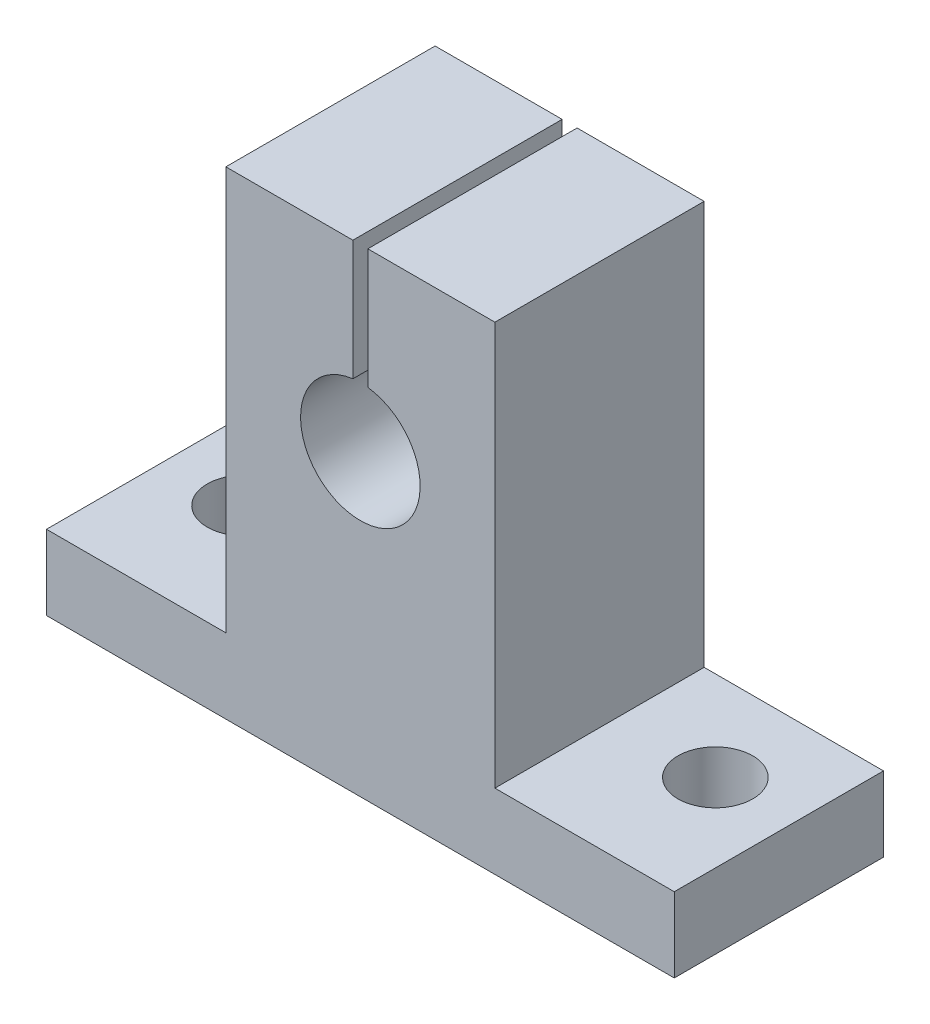
ISO-10303-21;
HEADER;
FILE_DESCRIPTION(('STEP AP214'),'2;1');
FILE_NAME('part.step','',(''),(''),'','','');
FILE_SCHEMA(('AUTOMOTIVE_DESIGN { 1 0 10303 214 1 1 1 1 }'));
ENDSEC;
DATA;
#1=APPLICATION_CONTEXT('core data for automotive mechanical design processes');
#2=APPLICATION_PROTOCOL_DEFINITION('international standard','automotive_design',2000,#1);
#3=PRODUCT_CONTEXT('',#1,'mechanical');
#4=PRODUCT('Part','Part','',(#3));
#5=PRODUCT_RELATED_PRODUCT_CATEGORY('part','',(#4));
#6=PRODUCT_DEFINITION_FORMATION('','',#4);
#7=PRODUCT_DEFINITION_CONTEXT('part definition',#1,'design');
#8=PRODUCT_DEFINITION('design','',#6,#7);
#9=PRODUCT_DEFINITION_SHAPE('','',#8);
#10=(LENGTH_UNIT() NAMED_UNIT(*) SI_UNIT(.MILLI.,.METRE.));
#11=(NAMED_UNIT(*) PLANE_ANGLE_UNIT() SI_UNIT($,.RADIAN.));
#12=(NAMED_UNIT(*) SI_UNIT($,.STERADIAN.) SOLID_ANGLE_UNIT());
#13=UNCERTAINTY_MEASURE_WITH_UNIT(LENGTH_MEASURE(1.E-05),#10,'distance_accuracy_value','');
#14=(GEOMETRIC_REPRESENTATION_CONTEXT(3) GLOBAL_UNCERTAINTY_ASSIGNED_CONTEXT((#13)) GLOBAL_UNIT_ASSIGNED_CONTEXT((#10,
#11,#12)) REPRESENTATION_CONTEXT('',''));
#15=CARTESIAN_POINT('',(0.,0.,0.));
#16=DIRECTION('',(0.,0.,1.));
#17=DIRECTION('',(1.,0.,0.));
#18=AXIS2_PLACEMENT_3D('',#15,#16,#17);
#19=CARTESIAN_POINT('',(0.,32.,0.));
#20=DIRECTION('',(0.,-1.,0.));
#21=DIRECTION('',(0.,0.,-1.));
#22=AXIS2_PLACEMENT_3D('',#19,#20,#21);
#23=PLANE('',#22);
#24=DIRECTION('',(1.,0.,0.));
#25=VECTOR('',#24,1.);
#26=CARTESIAN_POINT('',(21.,32.,7.));
#27=LINE('',#26,#25);
#28=CARTESIAN_POINT('',(-8.99999999999998,32.,7.));
#29=VERTEX_POINT('',#28);
#30=CARTESIAN_POINT('',(-0.499999999999999,32.,7.));
#31=VERTEX_POINT('',#30);
#32=EDGE_CURVE('E149',#29,#31,#27,.T.);
#33=ORIENTED_EDGE('',*,*,#32,.T.);
#34=DIRECTION('',(0.,0.,1.));
#35=VECTOR('',#34,1.);
#36=CARTESIAN_POINT('',(-0.499999999999999,32.,-7.));
#37=LINE('',#36,#35);
#38=CARTESIAN_POINT('',(-0.499999999999999,32.,-7.));
#39=VERTEX_POINT('',#38);
#40=EDGE_CURVE('E126',#39,#31,#37,.T.);
#41=ORIENTED_EDGE('',*,*,#40,.F.);
#42=DIRECTION('',(-1.,0.,0.));
#43=VECTOR('',#42,1.);
#44=CARTESIAN_POINT('',(21.,32.,-7.));
#45=LINE('',#44,#43);
#46=CARTESIAN_POINT('',(-8.99999999999999,32.,-7.));
#47=VERTEX_POINT('',#46);
#48=EDGE_CURVE('E145',#39,#47,#45,.T.);
#49=ORIENTED_EDGE('',*,*,#48,.T.);
#50=DIRECTION('',(0.,0.,1.));
#51=VECTOR('',#50,1.);
#52=CARTESIAN_POINT('',(-8.99999999999999,32.,-7.));
#53=LINE('',#52,#51);
#54=EDGE_CURVE('E157',#47,#29,#53,.T.);
#55=ORIENTED_EDGE('',*,*,#54,.T.);
#56=EDGE_LOOP('',(#33,#41,#49,#55));
#57=FACE_BOUND('',#56,.T.);
#58=ADVANCED_FACE('F33',(#57),#23,.F.);
#59=CARTESIAN_POINT('',(-21.,32.,-7.));
#60=DIRECTION('',(1.,0.,0.));
#61=DIRECTION('',(0.,0.,-1.));
#62=AXIS2_PLACEMENT_3D('',#59,#60,#61);
#63=PLANE('',#62);
#64=DIRECTION('',(0.,-1.,0.));
#65=VECTOR('',#64,1.);
#66=CARTESIAN_POINT('',(-21.,32.,7.));
#67=LINE('',#66,#65);
#68=CARTESIAN_POINT('',(-21.,5.,7.));
#69=VERTEX_POINT('',#68);
#70=CARTESIAN_POINT('',(-21.,0.,7.));
#71=VERTEX_POINT('',#70);
#72=EDGE_CURVE('E170',#69,#71,#67,.T.);
#73=ORIENTED_EDGE('',*,*,#72,.F.);
#74=DIRECTION('',(0.,0.,1.));
#75=VECTOR('',#74,1.);
#76=CARTESIAN_POINT('',(-21.,5.,-7.));
#77=LINE('',#76,#75);
#78=CARTESIAN_POINT('',(-21.,5.,-7.));
#79=VERTEX_POINT('',#78);
#80=EDGE_CURVE('E195',#79,#69,#77,.T.);
#81=ORIENTED_EDGE('',*,*,#80,.F.);
#82=DIRECTION('',(0.,-1.,0.));
#83=VECTOR('',#82,1.);
#84=CARTESIAN_POINT('',(-21.,32.,-7.));
#85=LINE('',#84,#83);
#86=CARTESIAN_POINT('',(-21.,0.,-7.));
#87=VERTEX_POINT('',#86);
#88=EDGE_CURVE('E144',#79,#87,#85,.T.);
#89=ORIENTED_EDGE('',*,*,#88,.T.);
#90=DIRECTION('',(0.,0.,1.));
#91=VECTOR('',#90,1.);
#92=CARTESIAN_POINT('',(-21.,0.,-7.));
#93=LINE('',#92,#91);
#94=EDGE_CURVE('E153',#87,#71,#93,.T.);
#95=ORIENTED_EDGE('',*,*,#94,.T.);
#96=EDGE_LOOP('',(#73,#81,#89,#95));
#97=FACE_BOUND('',#96,.T.);
#98=ADVANCED_FACE('F35',(#97),#63,.F.);
#99=CARTESIAN_POINT('',(21.,32.,7.));
#100=DIRECTION('',(0.,0.,-1.));
#101=DIRECTION('',(-1.,0.,0.));
#102=AXIS2_PLACEMENT_3D('',#99,#100,#101);
#103=PLANE('',#102);
#104=CARTESIAN_POINT('',(0.,20.,7.));
#105=DIRECTION('',(0.,0.,1.));
#106=DIRECTION('',(1.,0.,0.));
#107=AXIS2_PLACEMENT_3D('',#104,#105,#106);
#108=CIRCLE('',#107,4.);
#109=CARTESIAN_POINT('',(-0.499999999999999,23.9686269665969,7.));
#110=VERTEX_POINT('',#109);
#111=CARTESIAN_POINT('',(0.500000000000001,23.9686269665969,7.));
#112=VERTEX_POINT('',#111);
#113=EDGE_CURVE('E175',#110,#112,#108,.T.);
#114=ORIENTED_EDGE('',*,*,#113,.F.);
#115=DIRECTION('',(0.,-1.,0.));
#116=VECTOR('',#115,1.);
#117=CARTESIAN_POINT('',(-0.499999999999999,18.0387009707893,7.));
#118=LINE('',#117,#116);
#119=EDGE_CURVE('E48',#31,#110,#118,.T.);
#120=ORIENTED_EDGE('',*,*,#119,.F.);
#121=ORIENTED_EDGE('',*,*,#32,.F.);
#122=DIRECTION('',(0.,1.,0.));
#123=VECTOR('',#122,1.);
#124=CARTESIAN_POINT('',(-8.99999999999999,32.,7.));
#125=LINE('',#124,#123);
#126=CARTESIAN_POINT('',(-8.99999999999999,5.,7.));
#127=VERTEX_POINT('',#126);
#128=EDGE_CURVE('E192',#127,#29,#125,.T.);
#129=ORIENTED_EDGE('',*,*,#128,.F.);
#130=DIRECTION('',(1.,0.,0.));
#131=VECTOR('',#130,1.);
#132=CARTESIAN_POINT('',(-21.,5.,7.));
#133=LINE('',#132,#131);
#134=EDGE_CURVE('E196',#69,#127,#133,.T.);
#135=ORIENTED_EDGE('',*,*,#134,.F.);
#136=ORIENTED_EDGE('',*,*,#72,.T.);
#137=DIRECTION('',(1.,0.,0.));
#138=VECTOR('',#137,1.);
#139=CARTESIAN_POINT('',(21.,0.,7.));
#140=LINE('',#139,#138);
#141=CARTESIAN_POINT('',(21.,0.,7.));
#142=VERTEX_POINT('',#141);
#143=EDGE_CURVE('E156',#71,#142,#140,.T.);
#144=ORIENTED_EDGE('',*,*,#143,.T.);
#145=DIRECTION('',(0.,-1.,0.));
#146=VECTOR('',#145,1.);
#147=CARTESIAN_POINT('',(21.,32.,7.));
#148=LINE('',#147,#146);
#149=CARTESIAN_POINT('',(21.,5.,7.));
#150=VERTEX_POINT('',#149);
#151=EDGE_CURVE('E168',#150,#142,#148,.T.);
#152=ORIENTED_EDGE('',*,*,#151,.F.);
#153=DIRECTION('',(1.,0.,0.));
#154=VECTOR('',#153,1.);
#155=CARTESIAN_POINT('',(21.,5.,7.));
#156=LINE('',#155,#154);
#157=CARTESIAN_POINT('',(9.00000000000001,5.,7.));
#158=VERTEX_POINT('',#157);
#159=EDGE_CURVE('E209',#158,#150,#156,.T.);
#160=ORIENTED_EDGE('',*,*,#159,.F.);
#161=DIRECTION('',(0.,-1.,0.));
#162=VECTOR('',#161,1.);
#163=CARTESIAN_POINT('',(9.00000000000001,32.,7.));
#164=LINE('',#163,#162);
#165=CARTESIAN_POINT('',(9.00000000000001,32.,7.));
#166=VERTEX_POINT('',#165);
#167=EDGE_CURVE('E186',#166,#158,#164,.T.);
#168=ORIENTED_EDGE('',*,*,#167,.F.);
#169=CARTESIAN_POINT('',(0.500000000000001,32.,7.));
#170=VERTEX_POINT('',#169);
#171=EDGE_CURVE('E165',#170,#166,#27,.T.);
#172=ORIENTED_EDGE('',*,*,#171,.F.);
#173=DIRECTION('',(0.,1.,0.));
#174=VECTOR('',#173,1.);
#175=CARTESIAN_POINT('',(0.500000000000001,18.0387009707893,7.));
#176=LINE('',#175,#174);
#177=EDGE_CURVE('E122',#112,#170,#176,.T.);
#178=ORIENTED_EDGE('',*,*,#177,.F.);
#179=EDGE_LOOP('',(#114,#120,#121,#129,#135,#136,#144,#152,#160,#168,#172,#178));
#180=FACE_BOUND('',#179,.T.);
#181=ADVANCED_FACE('F177',(#180),#103,.F.);
#182=CARTESIAN_POINT('',(21.,32.,-7.));
#183=DIRECTION('',(-1.,0.,0.));
#184=DIRECTION('',(0.,0.,1.));
#185=AXIS2_PLACEMENT_3D('',#182,#183,#184);
#186=PLANE('',#185);
#187=DIRECTION('',(0.,-1.,0.));
#188=VECTOR('',#187,1.);
#189=CARTESIAN_POINT('',(21.,32.,-7.));
#190=LINE('',#189,#188);
#191=CARTESIAN_POINT('',(21.,5.,-7.));
#192=VERTEX_POINT('',#191);
#193=CARTESIAN_POINT('',(21.,0.,-7.));
#194=VERTEX_POINT('',#193);
#195=EDGE_CURVE('E147',#192,#194,#190,.T.);
#196=ORIENTED_EDGE('',*,*,#195,.F.);
#197=DIRECTION('',(0.,0.,1.));
#198=VECTOR('',#197,1.);
#199=CARTESIAN_POINT('',(21.,5.,-7.));
#200=LINE('',#199,#198);
#201=EDGE_CURVE('E199',#192,#150,#200,.T.);
#202=ORIENTED_EDGE('',*,*,#201,.T.);
#203=ORIENTED_EDGE('',*,*,#151,.T.);
#204=DIRECTION('',(0.,0.,-1.));
#205=VECTOR('',#204,1.);
#206=CARTESIAN_POINT('',(21.,0.,-7.));
#207=LINE('',#206,#205);
#208=EDGE_CURVE('E160',#142,#194,#207,.T.);
#209=ORIENTED_EDGE('',*,*,#208,.T.);
#210=EDGE_LOOP('',(#196,#202,#203,#209));
#211=FACE_BOUND('',#210,.T.);
#212=ADVANCED_FACE('F227',(#211),#186,.F.);
#213=CARTESIAN_POINT('',(21.,32.,-7.));
#214=DIRECTION('',(0.,0.,1.));
#215=DIRECTION('',(1.,0.,0.));
#216=AXIS2_PLACEMENT_3D('',#213,#214,#215);
#217=PLANE('',#216);
#218=ORIENTED_EDGE('',*,*,#48,.F.);
#219=DIRECTION('',(0.,-1.,0.));
#220=VECTOR('',#219,1.);
#221=CARTESIAN_POINT('',(-0.499999999999999,18.0387009707893,-7.));
#222=LINE('',#221,#220);
#223=CARTESIAN_POINT('',(-0.499999999999999,23.9686269665969,-7.));
#224=VERTEX_POINT('',#223);
#225=EDGE_CURVE('E138',#39,#224,#222,.T.);
#226=ORIENTED_EDGE('',*,*,#225,.T.);
#227=CARTESIAN_POINT('',(0.,20.,-7.));
#228=DIRECTION('',(0.,0.,1.));
#229=DIRECTION('',(1.,0.,0.));
#230=AXIS2_PLACEMENT_3D('',#227,#228,#229);
#231=CIRCLE('',#230,4.);
#232=CARTESIAN_POINT('',(0.5,23.9686269665969,-7.));
#233=VERTEX_POINT('',#232);
#234=EDGE_CURVE('E137',#224,#233,#231,.T.);
#235=ORIENTED_EDGE('',*,*,#234,.T.);
#236=DIRECTION('',(0.,1.,0.));
#237=VECTOR('',#236,1.);
#238=CARTESIAN_POINT('',(0.500000000000001,18.0387009707893,-7.));
#239=LINE('',#238,#237);
#240=CARTESIAN_POINT('',(0.500000000000001,32.,-7.));
#241=VERTEX_POINT('',#240);
#242=EDGE_CURVE('E55',#233,#241,#239,.T.);
#243=ORIENTED_EDGE('',*,*,#242,.T.);
#244=CARTESIAN_POINT('',(9.00000000000001,32.,-7.));
#245=VERTEX_POINT('',#244);
#246=EDGE_CURVE('E134',#245,#241,#45,.T.);
#247=ORIENTED_EDGE('',*,*,#246,.F.);
#248=DIRECTION('',(0.,-1.,0.));
#249=VECTOR('',#248,1.);
#250=CARTESIAN_POINT('',(9.00000000000001,32.,-7.));
#251=LINE('',#250,#249);
#252=CARTESIAN_POINT('',(9.00000000000001,5.,-7.));
#253=VERTEX_POINT('',#252);
#254=EDGE_CURVE('E206',#245,#253,#251,.T.);
#255=ORIENTED_EDGE('',*,*,#254,.T.);
#256=DIRECTION('',(1.,0.,0.));
#257=VECTOR('',#256,1.);
#258=CARTESIAN_POINT('',(21.,5.,-7.));
#259=LINE('',#258,#257);
#260=EDGE_CURVE('E208',#253,#192,#259,.T.);
#261=ORIENTED_EDGE('',*,*,#260,.T.);
#262=ORIENTED_EDGE('',*,*,#195,.T.);
#263=DIRECTION('',(-1.,0.,0.));
#264=VECTOR('',#263,1.);
#265=CARTESIAN_POINT('',(21.,0.,-7.));
#266=LINE('',#265,#264);
#267=EDGE_CURVE('E163',#194,#87,#266,.T.);
#268=ORIENTED_EDGE('',*,*,#267,.T.);
#269=ORIENTED_EDGE('',*,*,#88,.F.);
#270=DIRECTION('',(1.,0.,0.));
#271=VECTOR('',#270,1.);
#272=CARTESIAN_POINT('',(-21.,5.,-7.));
#273=LINE('',#272,#271);
#274=CARTESIAN_POINT('',(-8.99999999999999,5.,-7.));
#275=VERTEX_POINT('',#274);
#276=EDGE_CURVE('E188',#79,#275,#273,.T.);
#277=ORIENTED_EDGE('',*,*,#276,.T.);
#278=DIRECTION('',(0.,1.,0.));
#279=VECTOR('',#278,1.);
#280=CARTESIAN_POINT('',(-8.99999999999999,32.,-7.));
#281=LINE('',#280,#279);
#282=EDGE_CURVE('E191',#275,#47,#281,.T.);
#283=ORIENTED_EDGE('',*,*,#282,.T.);
#284=EDGE_LOOP('',(#218,#226,#235,#243,#247,#255,#261,#262,#268,#269,#277,#283));
#285=FACE_BOUND('',#284,.T.);
#286=ADVANCED_FACE('F132',(#285),#217,.F.);
#287=ORIENTED_EDGE('',*,*,#246,.T.);
#288=DIRECTION('',(0.,0.,1.));
#289=VECTOR('',#288,1.);
#290=CARTESIAN_POINT('',(0.500000000000001,32.,-7.));
#291=LINE('',#290,#289);
#292=EDGE_CURVE('E119',#241,#170,#291,.T.);
#293=ORIENTED_EDGE('',*,*,#292,.T.);
#294=ORIENTED_EDGE('',*,*,#171,.T.);
#295=DIRECTION('',(0.,0.,1.));
#296=VECTOR('',#295,1.);
#297=CARTESIAN_POINT('',(9.00000000000001,32.,-7.));
#298=LINE('',#297,#296);
#299=EDGE_CURVE('E143',#245,#166,#298,.T.);
#300=ORIENTED_EDGE('',*,*,#299,.F.);
#301=EDGE_LOOP('',(#287,#293,#294,#300));
#302=FACE_BOUND('',#301,.T.);
#303=ADVANCED_FACE('F141',(#302),#23,.F.);
#304=CARTESIAN_POINT('',(0.,0.,0.));
#305=DIRECTION('',(0.,-1.,0.));
#306=DIRECTION('',(0.,0.,-1.));
#307=AXIS2_PLACEMENT_3D('',#304,#305,#306);
#308=PLANE('',#307);
#309=CARTESIAN_POINT('',(-15.75,0.,-1.));
#310=DIRECTION('',(0.,1.,0.));
#311=DIRECTION('',(0.,0.,1.));
#312=AXIS2_PLACEMENT_3D('',#309,#310,#311);
#313=CIRCLE('',#312,2.5);
#314=CARTESIAN_POINT('',(-15.75,0.,1.5));
#315=VERTEX_POINT('',#314);
#316=EDGE_CURVE('E181',#315,#315,#313,.T.);
#317=ORIENTED_EDGE('',*,*,#316,.T.);
#318=EDGE_LOOP('',(#317));
#319=FACE_BOUND('',#318,.T.);
#320=CARTESIAN_POINT('',(15.75,0.,-1.));
#321=DIRECTION('',(0.,1.,0.));
#322=DIRECTION('',(0.,0.,1.));
#323=AXIS2_PLACEMENT_3D('',#320,#321,#322);
#324=CIRCLE('',#323,2.5);
#325=CARTESIAN_POINT('',(15.75,0.,1.5));
#326=VERTEX_POINT('',#325);
#327=EDGE_CURVE('E353',#326,#326,#324,.T.);
#328=ORIENTED_EDGE('',*,*,#327,.T.);
#329=EDGE_LOOP('',(#328));
#330=FACE_BOUND('',#329,.T.);
#331=ORIENTED_EDGE('',*,*,#94,.F.);
#332=ORIENTED_EDGE('',*,*,#267,.F.);
#333=ORIENTED_EDGE('',*,*,#208,.F.);
#334=ORIENTED_EDGE('',*,*,#143,.F.);
#335=EDGE_LOOP('',(#331,#332,#333,#334));
#336=FACE_BOUND('',#335,.T.);
#337=ADVANCED_FACE('F234',(#319,#330,#336),#308,.T.);
#338=CARTESIAN_POINT('',(21.,5.,-7.));
#339=DIRECTION('',(0.,-1.,0.));
#340=DIRECTION('',(1.,0.,0.));
#341=AXIS2_PLACEMENT_3D('',#338,#339,#340);
#342=PLANE('',#341);
#343=CARTESIAN_POINT('',(15.75,5.,-1.));
#344=DIRECTION('',(0.,1.,0.));
#345=DIRECTION('',(0.,0.,1.));
#346=AXIS2_PLACEMENT_3D('',#343,#344,#345);
#347=CIRCLE('',#346,2.5);
#348=CARTESIAN_POINT('',(15.75,5.,1.5));
#349=VERTEX_POINT('',#348);
#350=EDGE_CURVE('E356',#349,#349,#347,.T.);
#351=ORIENTED_EDGE('',*,*,#350,.F.);
#352=EDGE_LOOP('',(#351));
#353=FACE_BOUND('',#352,.T.);
#354=ORIENTED_EDGE('',*,*,#159,.T.);
#355=ORIENTED_EDGE('',*,*,#201,.F.);
#356=ORIENTED_EDGE('',*,*,#260,.F.);
#357=DIRECTION('',(0.,0.,1.));
#358=VECTOR('',#357,1.);
#359=CARTESIAN_POINT('',(9.00000000000001,5.,-7.));
#360=LINE('',#359,#358);
#361=EDGE_CURVE('E217',#253,#158,#360,.T.);
#362=ORIENTED_EDGE('',*,*,#361,.T.);
#363=EDGE_LOOP('',(#354,#355,#356,#362));
#364=FACE_BOUND('',#363,.T.);
#365=ADVANCED_FACE('F223',(#353,#364),#342,.F.);
#366=CARTESIAN_POINT('',(9.00000000000001,32.,-7.));
#367=DIRECTION('',(-1.,0.,0.));
#368=DIRECTION('',(0.,0.,1.));
#369=AXIS2_PLACEMENT_3D('',#366,#367,#368);
#370=PLANE('',#369);
#371=ORIENTED_EDGE('',*,*,#167,.T.);
#372=ORIENTED_EDGE('',*,*,#361,.F.);
#373=ORIENTED_EDGE('',*,*,#254,.F.);
#374=ORIENTED_EDGE('',*,*,#299,.T.);
#375=EDGE_LOOP('',(#371,#372,#373,#374));
#376=FACE_BOUND('',#375,.T.);
#377=ADVANCED_FACE('F219',(#376),#370,.F.);
#378=CARTESIAN_POINT('',(-8.99999999999999,32.,-7.));
#379=DIRECTION('',(1.,0.,0.));
#380=DIRECTION('',(0.,1.,0.));
#381=AXIS2_PLACEMENT_3D('',#378,#379,#380);
#382=PLANE('',#381);
#383=ORIENTED_EDGE('',*,*,#128,.T.);
#384=ORIENTED_EDGE('',*,*,#54,.F.);
#385=ORIENTED_EDGE('',*,*,#282,.F.);
#386=DIRECTION('',(0.,0.,1.));
#387=VECTOR('',#386,1.);
#388=CARTESIAN_POINT('',(-8.99999999999999,5.,-7.));
#389=LINE('',#388,#387);
#390=EDGE_CURVE('E203',#275,#127,#389,.T.);
#391=ORIENTED_EDGE('',*,*,#390,.T.);
#392=EDGE_LOOP('',(#383,#384,#385,#391));
#393=FACE_BOUND('',#392,.T.);
#394=ADVANCED_FACE('F246',(#393),#382,.F.);
#395=CARTESIAN_POINT('',(-21.,5.,-7.));
#396=DIRECTION('',(0.,-1.,0.));
#397=DIRECTION('',(0.,0.,-1.));
#398=AXIS2_PLACEMENT_3D('',#395,#396,#397);
#399=PLANE('',#398);
#400=CARTESIAN_POINT('',(-15.75,5.,-1.));
#401=DIRECTION('',(0.,1.,0.));
#402=DIRECTION('',(0.,0.,1.));
#403=AXIS2_PLACEMENT_3D('',#400,#401,#402);
#404=CIRCLE('',#403,2.5);
#405=CARTESIAN_POINT('',(-15.75,5.,1.5));
#406=VERTEX_POINT('',#405);
#407=EDGE_CURVE('E359',#406,#406,#404,.T.);
#408=ORIENTED_EDGE('',*,*,#407,.F.);
#409=EDGE_LOOP('',(#408));
#410=FACE_BOUND('',#409,.T.);
#411=ORIENTED_EDGE('',*,*,#134,.T.);
#412=ORIENTED_EDGE('',*,*,#390,.F.);
#413=ORIENTED_EDGE('',*,*,#276,.F.);
#414=ORIENTED_EDGE('',*,*,#80,.T.);
#415=EDGE_LOOP('',(#411,#412,#413,#414));
#416=FACE_BOUND('',#415,.T.);
#417=ADVANCED_FACE('F240',(#410,#416),#399,.F.);
#418=CARTESIAN_POINT('',(0.,20.,-7.));
#419=DIRECTION('',(0.,0.,1.));
#420=DIRECTION('',(1.,0.,0.));
#421=AXIS2_PLACEMENT_3D('',#418,#419,#420);
#422=CYLINDRICAL_SURFACE('',#421,4.);
#423=ORIENTED_EDGE('',*,*,#234,.F.);
#424=DIRECTION('',(0.,0.,1.));
#425=VECTOR('',#424,1.);
#426=CARTESIAN_POINT('',(-0.499999999999999,23.9686269665969,-7.));
#427=LINE('',#426,#425);
#428=EDGE_CURVE('E11',#224,#110,#427,.T.);
#429=ORIENTED_EDGE('',*,*,#428,.T.);
#430=ORIENTED_EDGE('',*,*,#113,.T.);
#431=DIRECTION('',(0.,0.,1.));
#432=VECTOR('',#431,1.);
#433=CARTESIAN_POINT('',(0.500000000000001,23.9686269665969,-7.));
#434=LINE('',#433,#432);
#435=EDGE_CURVE('E41',#112,#233,#434,.F.);
#436=ORIENTED_EDGE('',*,*,#435,.T.);
#437=EDGE_LOOP('',(#423,#429,#430,#436));
#438=FACE_BOUND('',#437,.T.);
#439=ADVANCED_FACE('F173',(#438),#422,.F.);
#440=CARTESIAN_POINT('',(0.500000000000001,18.0387009707893,-7.));
#441=DIRECTION('',(1.,0.,0.));
#442=DIRECTION('',(0.,0.,-1.));
#443=AXIS2_PLACEMENT_3D('',#440,#441,#442);
#444=PLANE('',#443);
#445=ORIENTED_EDGE('',*,*,#177,.T.);
#446=ORIENTED_EDGE('',*,*,#292,.F.);
#447=ORIENTED_EDGE('',*,*,#242,.F.);
#448=ORIENTED_EDGE('',*,*,#435,.F.);
#449=EDGE_LOOP('',(#445,#446,#447,#448));
#450=FACE_BOUND('',#449,.T.);
#451=ADVANCED_FACE('F120',(#450),#444,.F.);
#452=CARTESIAN_POINT('',(-0.499999999999999,18.0387009707893,-7.));
#453=DIRECTION('',(-1.,0.,0.));
#454=DIRECTION('',(0.,0.,1.));
#455=AXIS2_PLACEMENT_3D('',#452,#453,#454);
#456=PLANE('',#455);
#457=ORIENTED_EDGE('',*,*,#225,.F.);
#458=ORIENTED_EDGE('',*,*,#40,.T.);
#459=ORIENTED_EDGE('',*,*,#119,.T.);
#460=ORIENTED_EDGE('',*,*,#428,.F.);
#461=EDGE_LOOP('',(#457,#458,#459,#460));
#462=FACE_BOUND('',#461,.T.);
#463=ADVANCED_FACE('F250',(#462),#456,.F.);
#464=CARTESIAN_POINT('',(-15.75,0.,-1.));
#465=DIRECTION('',(0.,1.,0.));
#466=DIRECTION('',(0.,0.,1.));
#467=AXIS2_PLACEMENT_3D('',#464,#465,#466);
#468=CYLINDRICAL_SURFACE('',#467,2.5);
#469=ORIENTED_EDGE('',*,*,#316,.F.);
#470=EDGE_LOOP('',(#469));
#471=FACE_BOUND('',#470,.T.);
#472=ORIENTED_EDGE('',*,*,#407,.T.);
#473=EDGE_LOOP('',(#472));
#474=FACE_BOUND('',#473,.T.);
#475=ADVANCED_FACE('F252',(#471,#474),#468,.F.);
#476=CARTESIAN_POINT('',(15.75,0.,-1.));
#477=DIRECTION('',(0.,1.,0.));
#478=DIRECTION('',(0.,0.,1.));
#479=AXIS2_PLACEMENT_3D('',#476,#477,#478);
#480=CYLINDRICAL_SURFACE('',#479,2.5);
#481=ORIENTED_EDGE('',*,*,#327,.F.);
#482=EDGE_LOOP('',(#481));
#483=FACE_BOUND('',#482,.T.);
#484=ORIENTED_EDGE('',*,*,#350,.T.);
#485=EDGE_LOOP('',(#484));
#486=FACE_BOUND('',#485,.T.);
#487=ADVANCED_FACE('F258',(#483,#486),#480,.F.);
#488=CLOSED_SHELL('',(#58,#98,#181,#212,#286,#303,#337,#365,#377,#394,#417,#439,#451,#463,#475,#487));
#489=MANIFOLD_SOLID_BREP('B2',#488);
#490=ADVANCED_BREP_SHAPE_REPRESENTATION('',(#18,#489),#14);
#491=SHAPE_DEFINITION_REPRESENTATION(#9,#490);
ENDSEC;
END-ISO-10303-21;
